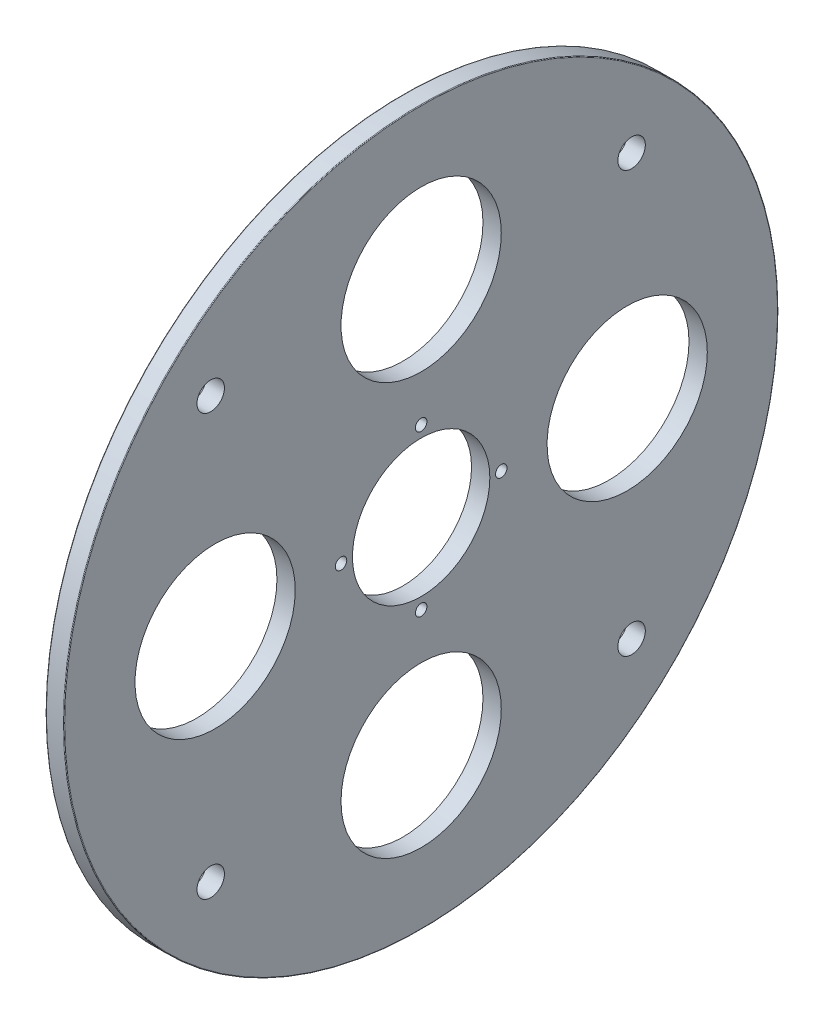
ISO-10303-21;
HEADER;
FILE_DESCRIPTION(('STEP AP214'),'2;1');
FILE_NAME('part.step','',(''),(''),'','','');
FILE_SCHEMA(('AUTOMOTIVE_DESIGN { 1 0 10303 214 1 1 1 1 }'));
ENDSEC;
DATA;
#1=APPLICATION_CONTEXT('core data for automotive mechanical design processes');
#2=APPLICATION_PROTOCOL_DEFINITION('international standard','automotive_design',2000,#1);
#3=PRODUCT_CONTEXT('',#1,'mechanical');
#4=PRODUCT('Part','Part','',(#3));
#5=PRODUCT_RELATED_PRODUCT_CATEGORY('part','',(#4));
#6=PRODUCT_DEFINITION_FORMATION('','',#4);
#7=PRODUCT_DEFINITION_CONTEXT('part definition',#1,'design');
#8=PRODUCT_DEFINITION('design','',#6,#7);
#9=PRODUCT_DEFINITION_SHAPE('','',#8);
#10=(LENGTH_UNIT() NAMED_UNIT(*) SI_UNIT(.MILLI.,.METRE.));
#11=(NAMED_UNIT(*) PLANE_ANGLE_UNIT() SI_UNIT($,.RADIAN.));
#12=(NAMED_UNIT(*) SI_UNIT($,.STERADIAN.) SOLID_ANGLE_UNIT());
#13=UNCERTAINTY_MEASURE_WITH_UNIT(LENGTH_MEASURE(1.E-05),#10,'distance_accuracy_value','');
#14=(GEOMETRIC_REPRESENTATION_CONTEXT(3) GLOBAL_UNCERTAINTY_ASSIGNED_CONTEXT((#13)) GLOBAL_UNIT_ASSIGNED_CONTEXT((#10,
#11,#12)) REPRESENTATION_CONTEXT('',''));
#15=CARTESIAN_POINT('',(0.,0.,0.));
#16=DIRECTION('',(0.,0.,1.));
#17=DIRECTION('',(1.,0.,0.));
#18=AXIS2_PLACEMENT_3D('',#15,#16,#17);
#19=CARTESIAN_POINT('',(8.,0.,0.));
#20=DIRECTION('',(-1.,0.,0.));
#21=DIRECTION('',(0.,0.,1.));
#22=AXIS2_PLACEMENT_3D('',#19,#20,#21);
#23=CYLINDRICAL_SURFACE('',#22,156.);
#24=CARTESIAN_POINT('',(0.3,0.,0.));
#25=DIRECTION('',(1.,0.,0.));
#26=DIRECTION('',(0.,0.,-1.));
#27=AXIS2_PLACEMENT_3D('',#24,#25,#26);
#28=CIRCLE('',#27,156.);
#29=CARTESIAN_POINT('',(0.3,0.,-156.));
#30=VERTEX_POINT('',#29);
#31=EDGE_CURVE('E50',#30,#30,#28,.T.);
#32=ORIENTED_EDGE('',*,*,#31,.T.);
#33=EDGE_LOOP('',(#32));
#34=FACE_BOUND('',#33,.T.);
#35=CARTESIAN_POINT('',(7.7,0.,0.));
#36=DIRECTION('',(1.,0.,0.));
#37=DIRECTION('',(0.,0.,-1.));
#38=AXIS2_PLACEMENT_3D('',#35,#36,#37);
#39=CIRCLE('',#38,156.);
#40=CARTESIAN_POINT('',(7.7,0.,-156.));
#41=VERTEX_POINT('',#40);
#42=EDGE_CURVE('E55',#41,#41,#39,.F.);
#43=ORIENTED_EDGE('',*,*,#42,.T.);
#44=EDGE_LOOP('',(#43));
#45=FACE_BOUND('',#44,.T.);
#46=ADVANCED_FACE('F37',(#34,#45),#23,.T.);
#47=CARTESIAN_POINT('',(8.,0.,0.));
#48=DIRECTION('',(1.,0.,0.));
#49=DIRECTION('',(0.,0.,-1.));
#50=AXIS2_PLACEMENT_3D('',#47,#48,#49);
#51=PLANE('',#50);
#52=CARTESIAN_POINT('',(8.,0.,0.));
#53=DIRECTION('',(1.,0.,0.));
#54=DIRECTION('',(0.,0.,-1.));
#55=AXIS2_PLACEMENT_3D('',#52,#53,#54);
#56=CIRCLE('',#55,155.7);
#57=CARTESIAN_POINT('',(8.,0.,-155.7));
#58=VERTEX_POINT('',#57);
#59=EDGE_CURVE('E10',#58,#58,#56,.T.);
#60=ORIENTED_EDGE('',*,*,#59,.T.);
#61=EDGE_LOOP('',(#60));
#62=FACE_BOUND('',#61,.T.);
#63=CARTESIAN_POINT('',(8.,-1.2220184685951E-13,-35.));
#64=DIRECTION('',(1.,0.,0.));
#65=DIRECTION('',(0.,-1.,0.));
#66=AXIS2_PLACEMENT_3D('',#63,#64,#65);
#67=CIRCLE('',#66,2.5);
#68=CARTESIAN_POINT('',(8.,-2.50000000000012,-35.));
#69=VERTEX_POINT('',#68);
#70=EDGE_CURVE('E75',#69,#69,#67,.T.);
#71=ORIENTED_EDGE('',*,*,#70,.F.);
#72=EDGE_LOOP('',(#71));
#73=FACE_BOUND('',#72,.T.);
#74=CARTESIAN_POINT('',(8.,-35.,0.));
#75=DIRECTION('',(1.,0.,0.));
#76=DIRECTION('',(0.,0.,1.));
#77=AXIS2_PLACEMENT_3D('',#74,#75,#76);
#78=CIRCLE('',#77,2.5);
#79=CARTESIAN_POINT('',(8.,-35.,2.5));
#80=VERTEX_POINT('',#79);
#81=EDGE_CURVE('E158',#80,#80,#78,.T.);
#82=ORIENTED_EDGE('',*,*,#81,.F.);
#83=EDGE_LOOP('',(#82));
#84=FACE_BOUND('',#83,.T.);
#85=CARTESIAN_POINT('',(8.,3.66605540578529E-13,35.));
#86=DIRECTION('',(1.,0.,0.));
#87=DIRECTION('',(0.,1.,0.));
#88=AXIS2_PLACEMENT_3D('',#85,#86,#87);
#89=CIRCLE('',#88,2.5);
#90=CARTESIAN_POINT('',(8.,2.50000000000037,35.));
#91=VERTEX_POINT('',#90);
#92=EDGE_CURVE('E154',#91,#91,#89,.T.);
#93=ORIENTED_EDGE('',*,*,#92,.F.);
#94=EDGE_LOOP('',(#93));
#95=FACE_BOUND('',#94,.T.);
#96=CARTESIAN_POINT('',(8.,35.,0.));
#97=DIRECTION('',(1.,0.,0.));
#98=DIRECTION('',(0.,0.,-1.));
#99=AXIS2_PLACEMENT_3D('',#96,#97,#98);
#100=CIRCLE('',#99,2.5);
#101=CARTESIAN_POINT('',(8.,35.,-2.5));
#102=VERTEX_POINT('',#101);
#103=EDGE_CURVE('E66',#102,#102,#100,.T.);
#104=ORIENTED_EDGE('',*,*,#103,.F.);
#105=EDGE_LOOP('',(#104));
#106=FACE_BOUND('',#105,.T.);
#107=CARTESIAN_POINT('',(8.,91.9238815542509,91.9238815542515));
#108=DIRECTION('',(1.,0.,0.));
#109=DIRECTION('',(0.,1.,0.));
#110=AXIS2_PLACEMENT_3D('',#107,#108,#109);
#111=CIRCLE('',#110,6.);
#112=CARTESIAN_POINT('',(8.,97.9238815542509,91.9238815542515));
#113=VERTEX_POINT('',#112);
#114=EDGE_CURVE('E94',#113,#113,#111,.T.);
#115=ORIENTED_EDGE('',*,*,#114,.F.);
#116=EDGE_LOOP('',(#115));
#117=FACE_BOUND('',#116,.T.);
#118=CARTESIAN_POINT('',(8.,-91.9238815542512,91.9238815542512));
#119=DIRECTION('',(1.,0.,0.));
#120=DIRECTION('',(0.,0.,1.));
#121=AXIS2_PLACEMENT_3D('',#118,#119,#120);
#122=CIRCLE('',#121,6.);
#123=CARTESIAN_POINT('',(8.,-91.9238815542512,97.9238815542512));
#124=VERTEX_POINT('',#123);
#125=EDGE_CURVE('E144',#124,#124,#122,.T.);
#126=ORIENTED_EDGE('',*,*,#125,.F.);
#127=EDGE_LOOP('',(#126));
#128=FACE_BOUND('',#127,.T.);
#129=CARTESIAN_POINT('',(8.,-91.9238815542502,-91.9238815542521));
#130=DIRECTION('',(1.,0.,0.));
#131=DIRECTION('',(0.,-1.,0.));
#132=AXIS2_PLACEMENT_3D('',#129,#130,#131);
#133=CIRCLE('',#132,6.);
#134=CARTESIAN_POINT('',(8.,-97.9238815542502,-91.9238815542522));
#135=VERTEX_POINT('',#134);
#136=EDGE_CURVE('E80',#135,#135,#133,.T.);
#137=ORIENTED_EDGE('',*,*,#136,.F.);
#138=EDGE_LOOP('',(#137));
#139=FACE_BOUND('',#138,.T.);
#140=CARTESIAN_POINT('',(8.,91.9238815542512,-91.9238815542512));
#141=DIRECTION('',(1.,0.,0.));
#142=DIRECTION('',(0.,0.,-1.));
#143=AXIS2_PLACEMENT_3D('',#140,#141,#142);
#144=CIRCLE('',#143,6.);
#145=CARTESIAN_POINT('',(8.,91.9238815542512,-97.9238815542512));
#146=VERTEX_POINT('',#145);
#147=EDGE_CURVE('E85',#146,#146,#144,.T.);
#148=ORIENTED_EDGE('',*,*,#147,.F.);
#149=EDGE_LOOP('',(#148));
#150=FACE_BOUND('',#149,.T.);
#151=CARTESIAN_POINT('',(8.,-3.14233320495882E-13,90.));
#152=DIRECTION('',(1.,0.,0.));
#153=DIRECTION('',(0.,1.,0.));
#154=AXIS2_PLACEMENT_3D('',#151,#152,#153);
#155=CIRCLE('',#154,35.);
#156=CARTESIAN_POINT('',(8.,34.9999999999997,90.0000000000001));
#157=VERTEX_POINT('',#156);
#158=EDGE_CURVE('E113',#157,#157,#155,.T.);
#159=ORIENTED_EDGE('',*,*,#158,.F.);
#160=EDGE_LOOP('',(#159));
#161=FACE_BOUND('',#160,.T.);
#162=CARTESIAN_POINT('',(8.,-90.,0.));
#163=DIRECTION('',(1.,0.,0.));
#164=DIRECTION('',(0.,0.,1.));
#165=AXIS2_PLACEMENT_3D('',#162,#163,#164);
#166=CIRCLE('',#165,35.);
#167=CARTESIAN_POINT('',(8.,-90.,35.));
#168=VERTEX_POINT('',#167);
#169=EDGE_CURVE('E131',#168,#168,#166,.T.);
#170=ORIENTED_EDGE('',*,*,#169,.F.);
#171=EDGE_LOOP('',(#170));
#172=FACE_BOUND('',#171,.T.);
#173=CARTESIAN_POINT('',(8.,9.42699961487646E-13,-90.));
#174=DIRECTION('',(1.,0.,0.));
#175=DIRECTION('',(0.,-1.,0.));
#176=AXIS2_PLACEMENT_3D('',#173,#174,#175);
#177=CIRCLE('',#176,35.);
#178=CARTESIAN_POINT('',(8.,-34.9999999999991,-90.0000000000004));
#179=VERTEX_POINT('',#178);
#180=EDGE_CURVE('E99',#179,#179,#177,.T.);
#181=ORIENTED_EDGE('',*,*,#180,.F.);
#182=EDGE_LOOP('',(#181));
#183=FACE_BOUND('',#182,.T.);
#184=CARTESIAN_POINT('',(8.,90.,0.));
#185=DIRECTION('',(1.,0.,0.));
#186=DIRECTION('',(0.,0.,-1.));
#187=AXIS2_PLACEMENT_3D('',#184,#185,#186);
#188=CIRCLE('',#187,35.);
#189=CARTESIAN_POINT('',(8.,90.,-35.));
#190=VERTEX_POINT('',#189);
#191=EDGE_CURVE('E104',#190,#190,#188,.T.);
#192=ORIENTED_EDGE('',*,*,#191,.F.);
#193=EDGE_LOOP('',(#192));
#194=FACE_BOUND('',#193,.T.);
#195=CARTESIAN_POINT('',(8.,0.,0.));
#196=DIRECTION('',(1.,0.,0.));
#197=DIRECTION('',(0.,0.,-1.));
#198=AXIS2_PLACEMENT_3D('',#195,#196,#197);
#199=CIRCLE('',#198,30.);
#200=CARTESIAN_POINT('',(8.,0.,-30.));
#201=VERTEX_POINT('',#200);
#202=EDGE_CURVE('E118',#201,#201,#199,.T.);
#203=ORIENTED_EDGE('',*,*,#202,.F.);
#204=EDGE_LOOP('',(#203));
#205=FACE_BOUND('',#204,.T.);
#206=ADVANCED_FACE('F169',(#62,#73,#84,#95,#106,#117,#128,#139,#150,#161,#172,#183,#194,#205),
#51,.T.);
#207=CARTESIAN_POINT('',(0.,0.,0.));
#208=DIRECTION('',(1.,0.,0.));
#209=DIRECTION('',(0.,0.,-1.));
#210=AXIS2_PLACEMENT_3D('',#207,#208,#209);
#211=PLANE('',#210);
#212=CARTESIAN_POINT('',(0.,0.,0.));
#213=DIRECTION('',(1.,0.,0.));
#214=DIRECTION('',(0.,0.,-1.));
#215=AXIS2_PLACEMENT_3D('',#212,#213,#214);
#216=CIRCLE('',#215,155.7);
#217=CARTESIAN_POINT('',(0.,0.,-155.7));
#218=VERTEX_POINT('',#217);
#219=EDGE_CURVE('E45',#218,#218,#216,.F.);
#220=ORIENTED_EDGE('',*,*,#219,.T.);
#221=EDGE_LOOP('',(#220));
#222=FACE_BOUND('',#221,.T.);
#223=CARTESIAN_POINT('',(0.,-1.2220184685951E-13,-35.));
#224=DIRECTION('',(1.,0.,0.));
#225=DIRECTION('',(0.,0.,-1.));
#226=AXIS2_PLACEMENT_3D('',#223,#224,#225);
#227=CIRCLE('',#226,2.5);
#228=CARTESIAN_POINT('',(0.,-1.2220184685951E-13,-37.5));
#229=VERTEX_POINT('',#228);
#230=EDGE_CURVE('E62',#229,#229,#227,.T.);
#231=ORIENTED_EDGE('',*,*,#230,.T.);
#232=EDGE_LOOP('',(#231));
#233=FACE_BOUND('',#232,.T.);
#234=CARTESIAN_POINT('',(0.,-35.,0.));
#235=DIRECTION('',(1.,0.,0.));
#236=DIRECTION('',(0.,0.,-1.));
#237=AXIS2_PLACEMENT_3D('',#234,#235,#236);
#238=CIRCLE('',#237,2.5);
#239=CARTESIAN_POINT('',(0.,-35.,-2.5));
#240=VERTEX_POINT('',#239);
#241=EDGE_CURVE('E67',#240,#240,#238,.T.);
#242=ORIENTED_EDGE('',*,*,#241,.T.);
#243=EDGE_LOOP('',(#242));
#244=FACE_BOUND('',#243,.T.);
#245=CARTESIAN_POINT('',(0.,3.66605540578529E-13,35.));
#246=DIRECTION('',(1.,0.,0.));
#247=DIRECTION('',(0.,0.,-1.));
#248=AXIS2_PLACEMENT_3D('',#245,#246,#247);
#249=CIRCLE('',#248,2.5);
#250=CARTESIAN_POINT('',(0.,3.66605540578529E-13,32.5));
#251=VERTEX_POINT('',#250);
#252=EDGE_CURVE('E71',#251,#251,#249,.T.);
#253=ORIENTED_EDGE('',*,*,#252,.T.);
#254=EDGE_LOOP('',(#253));
#255=FACE_BOUND('',#254,.T.);
#256=CARTESIAN_POINT('',(0.,35.,0.));
#257=DIRECTION('',(1.,0.,0.));
#258=DIRECTION('',(0.,0.,-1.));
#259=AXIS2_PLACEMENT_3D('',#256,#257,#258);
#260=CIRCLE('',#259,2.5);
#261=CARTESIAN_POINT('',(0.,35.,-2.5));
#262=VERTEX_POINT('',#261);
#263=EDGE_CURVE('E76',#262,#262,#260,.T.);
#264=ORIENTED_EDGE('',*,*,#263,.T.);
#265=EDGE_LOOP('',(#264));
#266=FACE_BOUND('',#265,.T.);
#267=CARTESIAN_POINT('',(0.,91.9238815542509,91.9238815542515));
#268=DIRECTION('',(1.,0.,0.));
#269=DIRECTION('',(0.,0.,-1.));
#270=AXIS2_PLACEMENT_3D('',#267,#268,#269);
#271=CIRCLE('',#270,6.);
#272=CARTESIAN_POINT('',(0.,91.9238815542509,85.9238815542515));
#273=VERTEX_POINT('',#272);
#274=EDGE_CURVE('E81',#273,#273,#271,.T.);
#275=ORIENTED_EDGE('',*,*,#274,.T.);
#276=EDGE_LOOP('',(#275));
#277=FACE_BOUND('',#276,.T.);
#278=CARTESIAN_POINT('',(0.,-91.9238815542512,91.9238815542512));
#279=DIRECTION('',(1.,0.,0.));
#280=DIRECTION('',(0.,0.,-1.));
#281=AXIS2_PLACEMENT_3D('',#278,#279,#280);
#282=CIRCLE('',#281,6.);
#283=CARTESIAN_POINT('',(0.,-91.9238815542512,85.9238815542512));
#284=VERTEX_POINT('',#283);
#285=EDGE_CURVE('E86',#284,#284,#282,.T.);
#286=ORIENTED_EDGE('',*,*,#285,.T.);
#287=EDGE_LOOP('',(#286));
#288=FACE_BOUND('',#287,.T.);
#289=CARTESIAN_POINT('',(0.,-91.9238815542502,-91.9238815542521));
#290=DIRECTION('',(1.,0.,0.));
#291=DIRECTION('',(0.,0.,-1.));
#292=AXIS2_PLACEMENT_3D('',#289,#290,#291);
#293=CIRCLE('',#292,6.);
#294=CARTESIAN_POINT('',(0.,-91.9238815542502,-97.9238815542521));
#295=VERTEX_POINT('',#294);
#296=EDGE_CURVE('E90',#295,#295,#293,.T.);
#297=ORIENTED_EDGE('',*,*,#296,.T.);
#298=EDGE_LOOP('',(#297));
#299=FACE_BOUND('',#298,.T.);
#300=CARTESIAN_POINT('',(0.,91.9238815542512,-91.9238815542512));
#301=DIRECTION('',(1.,0.,0.));
#302=DIRECTION('',(0.,0.,-1.));
#303=AXIS2_PLACEMENT_3D('',#300,#301,#302);
#304=CIRCLE('',#303,6.);
#305=CARTESIAN_POINT('',(0.,91.9238815542512,-97.9238815542512));
#306=VERTEX_POINT('',#305);
#307=EDGE_CURVE('E95',#306,#306,#304,.T.);
#308=ORIENTED_EDGE('',*,*,#307,.T.);
#309=EDGE_LOOP('',(#308));
#310=FACE_BOUND('',#309,.T.);
#311=CARTESIAN_POINT('',(0.,-3.14233320495882E-13,90.));
#312=DIRECTION('',(1.,0.,0.));
#313=DIRECTION('',(0.,0.,-1.));
#314=AXIS2_PLACEMENT_3D('',#311,#312,#313);
#315=CIRCLE('',#314,35.);
#316=CARTESIAN_POINT('',(0.,-3.14233320495882E-13,55.));
#317=VERTEX_POINT('',#316);
#318=EDGE_CURVE('E100',#317,#317,#315,.T.);
#319=ORIENTED_EDGE('',*,*,#318,.T.);
#320=EDGE_LOOP('',(#319));
#321=FACE_BOUND('',#320,.T.);
#322=CARTESIAN_POINT('',(0.,-90.,0.));
#323=DIRECTION('',(1.,0.,0.));
#324=DIRECTION('',(0.,0.,-1.));
#325=AXIS2_PLACEMENT_3D('',#322,#323,#324);
#326=CIRCLE('',#325,35.);
#327=CARTESIAN_POINT('',(0.,-90.,-35.));
#328=VERTEX_POINT('',#327);
#329=EDGE_CURVE('E105',#328,#328,#326,.T.);
#330=ORIENTED_EDGE('',*,*,#329,.T.);
#331=EDGE_LOOP('',(#330));
#332=FACE_BOUND('',#331,.T.);
#333=CARTESIAN_POINT('',(0.,9.42699961487646E-13,-90.));
#334=DIRECTION('',(1.,0.,0.));
#335=DIRECTION('',(0.,0.,-1.));
#336=AXIS2_PLACEMENT_3D('',#333,#334,#335);
#337=CIRCLE('',#336,35.);
#338=CARTESIAN_POINT('',(0.,9.42699961487646E-13,-125.));
#339=VERTEX_POINT('',#338);
#340=EDGE_CURVE('E109',#339,#339,#337,.T.);
#341=ORIENTED_EDGE('',*,*,#340,.T.);
#342=EDGE_LOOP('',(#341));
#343=FACE_BOUND('',#342,.T.);
#344=CARTESIAN_POINT('',(0.,90.,0.));
#345=DIRECTION('',(1.,0.,0.));
#346=DIRECTION('',(0.,0.,-1.));
#347=AXIS2_PLACEMENT_3D('',#344,#345,#346);
#348=CIRCLE('',#347,35.);
#349=CARTESIAN_POINT('',(0.,90.,-35.));
#350=VERTEX_POINT('',#349);
#351=EDGE_CURVE('E114',#350,#350,#348,.T.);
#352=ORIENTED_EDGE('',*,*,#351,.T.);
#353=EDGE_LOOP('',(#352));
#354=FACE_BOUND('',#353,.T.);
#355=CARTESIAN_POINT('',(0.,0.,0.));
#356=DIRECTION('',(1.,0.,0.));
#357=DIRECTION('',(0.,0.,-1.));
#358=AXIS2_PLACEMENT_3D('',#355,#356,#357);
#359=CIRCLE('',#358,30.);
#360=CARTESIAN_POINT('',(0.,0.,-30.));
#361=VERTEX_POINT('',#360);
#362=EDGE_CURVE('E61',#361,#361,#359,.T.);
#363=ORIENTED_EDGE('',*,*,#362,.T.);
#364=EDGE_LOOP('',(#363));
#365=FACE_BOUND('',#364,.T.);
#366=ADVANCED_FACE('F172',(#222,#233,#244,#255,#266,#277,#288,#299,#310,#321,#332,#343,#354,
#365),#211,.F.);
#367=CARTESIAN_POINT('',(-2.,0.,0.));
#368=DIRECTION('',(1.,0.,0.));
#369=DIRECTION('',(0.,0.,-1.));
#370=AXIS2_PLACEMENT_3D('',#367,#368,#369);
#371=CYLINDRICAL_SURFACE('',#370,30.);
#372=ORIENTED_EDGE('',*,*,#202,.T.);
#373=EDGE_LOOP('',(#372));
#374=FACE_BOUND('',#373,.T.);
#375=ORIENTED_EDGE('',*,*,#362,.F.);
#376=EDGE_LOOP('',(#375));
#377=FACE_BOUND('',#376,.T.);
#378=ADVANCED_FACE('F198',(#374,#377),#371,.F.);
#379=CARTESIAN_POINT('',(-2.,90.,0.));
#380=DIRECTION('',(1.,0.,0.));
#381=DIRECTION('',(0.,0.,-1.));
#382=AXIS2_PLACEMENT_3D('',#379,#380,#381);
#383=CYLINDRICAL_SURFACE('',#382,35.);
#384=ORIENTED_EDGE('',*,*,#191,.T.);
#385=EDGE_LOOP('',(#384));
#386=FACE_BOUND('',#385,.T.);
#387=ORIENTED_EDGE('',*,*,#351,.F.);
#388=EDGE_LOOP('',(#387));
#389=FACE_BOUND('',#388,.T.);
#390=ADVANCED_FACE('F201',(#386,#389),#383,.F.);
#391=CARTESIAN_POINT('',(-2.,9.42699961487646E-13,-90.));
#392=DIRECTION('',(1.,0.,0.));
#393=DIRECTION('',(0.,0.,-1.));
#394=AXIS2_PLACEMENT_3D('',#391,#392,#393);
#395=CYLINDRICAL_SURFACE('',#394,35.);
#396=ORIENTED_EDGE('',*,*,#180,.T.);
#397=EDGE_LOOP('',(#396));
#398=FACE_BOUND('',#397,.T.);
#399=ORIENTED_EDGE('',*,*,#340,.F.);
#400=EDGE_LOOP('',(#399));
#401=FACE_BOUND('',#400,.T.);
#402=ADVANCED_FACE('F265',(#398,#401),#395,.F.);
#403=CARTESIAN_POINT('',(-2.,-90.,0.));
#404=DIRECTION('',(1.,0.,0.));
#405=DIRECTION('',(0.,0.,-1.));
#406=AXIS2_PLACEMENT_3D('',#403,#404,#405);
#407=CYLINDRICAL_SURFACE('',#406,35.);
#408=ORIENTED_EDGE('',*,*,#169,.T.);
#409=EDGE_LOOP('',(#408));
#410=FACE_BOUND('',#409,.T.);
#411=ORIENTED_EDGE('',*,*,#329,.F.);
#412=EDGE_LOOP('',(#411));
#413=FACE_BOUND('',#412,.T.);
#414=ADVANCED_FACE('F261',(#410,#413),#407,.F.);
#415=CARTESIAN_POINT('',(-2.,-3.14233320495882E-13,90.));
#416=DIRECTION('',(1.,0.,0.));
#417=DIRECTION('',(0.,0.,-1.));
#418=AXIS2_PLACEMENT_3D('',#415,#416,#417);
#419=CYLINDRICAL_SURFACE('',#418,35.);
#420=ORIENTED_EDGE('',*,*,#158,.T.);
#421=EDGE_LOOP('',(#420));
#422=FACE_BOUND('',#421,.T.);
#423=ORIENTED_EDGE('',*,*,#318,.F.);
#424=EDGE_LOOP('',(#423));
#425=FACE_BOUND('',#424,.T.);
#426=ADVANCED_FACE('F257',(#422,#425),#419,.F.);
#427=CARTESIAN_POINT('',(-2.,91.9238815542512,-91.9238815542512));
#428=DIRECTION('',(1.,0.,0.));
#429=DIRECTION('',(0.,0.,-1.));
#430=AXIS2_PLACEMENT_3D('',#427,#428,#429);
#431=CYLINDRICAL_SURFACE('',#430,6.);
#432=ORIENTED_EDGE('',*,*,#147,.T.);
#433=EDGE_LOOP('',(#432));
#434=FACE_BOUND('',#433,.T.);
#435=ORIENTED_EDGE('',*,*,#307,.F.);
#436=EDGE_LOOP('',(#435));
#437=FACE_BOUND('',#436,.T.);
#438=ADVANCED_FACE('F253',(#434,#437),#431,.F.);
#439=CARTESIAN_POINT('',(-2.,-91.9238815542502,-91.9238815542521));
#440=DIRECTION('',(1.,0.,0.));
#441=DIRECTION('',(0.,0.,-1.));
#442=AXIS2_PLACEMENT_3D('',#439,#440,#441);
#443=CYLINDRICAL_SURFACE('',#442,6.);
#444=ORIENTED_EDGE('',*,*,#136,.T.);
#445=EDGE_LOOP('',(#444));
#446=FACE_BOUND('',#445,.T.);
#447=ORIENTED_EDGE('',*,*,#296,.F.);
#448=EDGE_LOOP('',(#447));
#449=FACE_BOUND('',#448,.T.);
#450=ADVANCED_FACE('F249',(#446,#449),#443,.F.);
#451=CARTESIAN_POINT('',(-2.,-91.9238815542512,91.9238815542512));
#452=DIRECTION('',(1.,0.,0.));
#453=DIRECTION('',(0.,0.,-1.));
#454=AXIS2_PLACEMENT_3D('',#451,#452,#453);
#455=CYLINDRICAL_SURFACE('',#454,6.);
#456=ORIENTED_EDGE('',*,*,#125,.T.);
#457=EDGE_LOOP('',(#456));
#458=FACE_BOUND('',#457,.T.);
#459=ORIENTED_EDGE('',*,*,#285,.F.);
#460=EDGE_LOOP('',(#459));
#461=FACE_BOUND('',#460,.T.);
#462=ADVANCED_FACE('F245',(#458,#461),#455,.F.);
#463=CARTESIAN_POINT('',(-2.,91.9238815542509,91.9238815542515));
#464=DIRECTION('',(1.,0.,0.));
#465=DIRECTION('',(0.,0.,-1.));
#466=AXIS2_PLACEMENT_3D('',#463,#464,#465);
#467=CYLINDRICAL_SURFACE('',#466,6.);
#468=ORIENTED_EDGE('',*,*,#114,.T.);
#469=EDGE_LOOP('',(#468));
#470=FACE_BOUND('',#469,.T.);
#471=ORIENTED_EDGE('',*,*,#274,.F.);
#472=EDGE_LOOP('',(#471));
#473=FACE_BOUND('',#472,.T.);
#474=ADVANCED_FACE('F241',(#470,#473),#467,.F.);
#475=CARTESIAN_POINT('',(-2.,35.,0.));
#476=DIRECTION('',(1.,0.,0.));
#477=DIRECTION('',(0.,0.,-1.));
#478=AXIS2_PLACEMENT_3D('',#475,#476,#477);
#479=CYLINDRICAL_SURFACE('',#478,2.5);
#480=ORIENTED_EDGE('',*,*,#103,.T.);
#481=EDGE_LOOP('',(#480));
#482=FACE_BOUND('',#481,.T.);
#483=ORIENTED_EDGE('',*,*,#263,.F.);
#484=EDGE_LOOP('',(#483));
#485=FACE_BOUND('',#484,.T.);
#486=ADVANCED_FACE('F237',(#482,#485),#479,.F.);
#487=CARTESIAN_POINT('',(-2.,3.66605540578529E-13,35.));
#488=DIRECTION('',(1.,0.,0.));
#489=DIRECTION('',(0.,0.,-1.));
#490=AXIS2_PLACEMENT_3D('',#487,#488,#489);
#491=CYLINDRICAL_SURFACE('',#490,2.5);
#492=ORIENTED_EDGE('',*,*,#92,.T.);
#493=EDGE_LOOP('',(#492));
#494=FACE_BOUND('',#493,.T.);
#495=ORIENTED_EDGE('',*,*,#252,.F.);
#496=EDGE_LOOP('',(#495));
#497=FACE_BOUND('',#496,.T.);
#498=ADVANCED_FACE('F231',(#494,#497),#491,.F.);
#499=CARTESIAN_POINT('',(-2.,-35.,0.));
#500=DIRECTION('',(1.,0.,0.));
#501=DIRECTION('',(0.,0.,-1.));
#502=AXIS2_PLACEMENT_3D('',#499,#500,#501);
#503=CYLINDRICAL_SURFACE('',#502,2.5);
#504=ORIENTED_EDGE('',*,*,#81,.T.);
#505=EDGE_LOOP('',(#504));
#506=FACE_BOUND('',#505,.T.);
#507=ORIENTED_EDGE('',*,*,#241,.F.);
#508=EDGE_LOOP('',(#507));
#509=FACE_BOUND('',#508,.T.);
#510=ADVANCED_FACE('F224',(#506,#509),#503,.F.);
#511=CARTESIAN_POINT('',(-2.,-1.2220184685951E-13,-35.));
#512=DIRECTION('',(1.,0.,0.));
#513=DIRECTION('',(0.,0.,-1.));
#514=AXIS2_PLACEMENT_3D('',#511,#512,#513);
#515=CYLINDRICAL_SURFACE('',#514,2.5);
#516=ORIENTED_EDGE('',*,*,#70,.T.);
#517=EDGE_LOOP('',(#516));
#518=FACE_BOUND('',#517,.T.);
#519=ORIENTED_EDGE('',*,*,#230,.F.);
#520=EDGE_LOOP('',(#519));
#521=FACE_BOUND('',#520,.T.);
#522=ADVANCED_FACE('F166',(#518,#521),#515,.F.);
#523=CARTESIAN_POINT('',(0.3,0.,0.));
#524=DIRECTION('',(1.,0.,0.));
#525=DIRECTION('',(0.,0.,-1.));
#526=AXIS2_PLACEMENT_3D('',#523,#524,#525);
#527=TOROIDAL_SURFACE('',#526,155.7,0.3);
#528=ORIENTED_EDGE('',*,*,#219,.F.);
#529=EDGE_LOOP('',(#528));
#530=FACE_BOUND('',#529,.T.);
#531=ORIENTED_EDGE('',*,*,#31,.F.);
#532=EDGE_LOOP('',(#531));
#533=FACE_BOUND('',#532,.T.);
#534=ADVANCED_FACE('F216',(#530,#533),#527,.T.);
#535=CARTESIAN_POINT('',(7.7,0.,0.));
#536=DIRECTION('',(1.,0.,0.));
#537=DIRECTION('',(0.,0.,-1.));
#538=AXIS2_PLACEMENT_3D('',#535,#536,#537);
#539=TOROIDAL_SURFACE('',#538,155.7,0.3);
#540=ORIENTED_EDGE('',*,*,#42,.F.);
#541=EDGE_LOOP('',(#540));
#542=FACE_BOUND('',#541,.T.);
#543=ORIENTED_EDGE('',*,*,#59,.F.);
#544=EDGE_LOOP('',(#543));
#545=FACE_BOUND('',#544,.T.);
#546=ADVANCED_FACE('F39',(#542,#545),#539,.T.);
#547=CLOSED_SHELL('',(#46,#206,#366,#378,#390,#402,#414,#426,#438,#450,#462,#474,#486,#498,#510,
#522,#534,#546));
#548=MANIFOLD_SOLID_BREP('B2',#547);
#549=ADVANCED_BREP_SHAPE_REPRESENTATION('',(#18,#548),#14);
#550=SHAPE_DEFINITION_REPRESENTATION(#9,#549);
ENDSEC;
END-ISO-10303-21;
